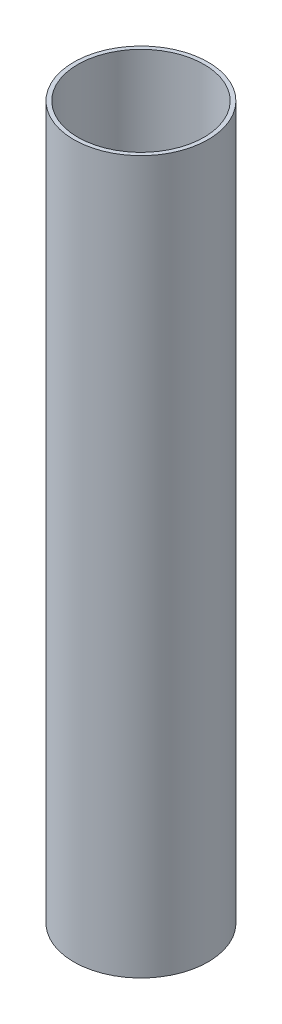
ISO-10303-21;
HEADER;
FILE_DESCRIPTION(('STEP AP214'),'2;1');
FILE_NAME('part.step','',(''),(''),'','','');
FILE_SCHEMA(('AUTOMOTIVE_DESIGN { 1 0 10303 214 1 1 1 1 }'));
ENDSEC;
DATA;
#1=APPLICATION_CONTEXT('core data for automotive mechanical design processes');
#2=APPLICATION_PROTOCOL_DEFINITION('international standard','automotive_design',2000,#1);
#3=PRODUCT_CONTEXT('',#1,'mechanical');
#4=PRODUCT('Part','Part','',(#3));
#5=PRODUCT_RELATED_PRODUCT_CATEGORY('part','',(#4));
#6=PRODUCT_DEFINITION_FORMATION('','',#4);
#7=PRODUCT_DEFINITION_CONTEXT('part definition',#1,'design');
#8=PRODUCT_DEFINITION('design','',#6,#7);
#9=PRODUCT_DEFINITION_SHAPE('','',#8);
#10=(LENGTH_UNIT() NAMED_UNIT(*) SI_UNIT(.MILLI.,.METRE.));
#11=(NAMED_UNIT(*) PLANE_ANGLE_UNIT() SI_UNIT($,.RADIAN.));
#12=(NAMED_UNIT(*) SI_UNIT($,.STERADIAN.) SOLID_ANGLE_UNIT());
#13=UNCERTAINTY_MEASURE_WITH_UNIT(LENGTH_MEASURE(1.E-05),#10,'distance_accuracy_value','');
#14=(GEOMETRIC_REPRESENTATION_CONTEXT(3) GLOBAL_UNCERTAINTY_ASSIGNED_CONTEXT((#13)) GLOBAL_UNIT_ASSIGNED_CONTEXT((#10,
#11,#12)) REPRESENTATION_CONTEXT('',''));
#15=CARTESIAN_POINT('',(0.,0.,0.));
#16=DIRECTION('',(0.,0.,1.));
#17=DIRECTION('',(1.,0.,0.));
#18=AXIS2_PLACEMENT_3D('',#15,#16,#17);
#19=CARTESIAN_POINT('',(0.,220.,0.));
#20=DIRECTION('',(0.,1.,0.));
#21=DIRECTION('',(0.,0.,1.));
#22=AXIS2_PLACEMENT_3D('',#19,#20,#21);
#23=PLANE('',#22);
#24=CARTESIAN_POINT('',(0.,220.,0.));
#25=DIRECTION('',(0.,1.,0.));
#26=DIRECTION('',(0.,0.,1.));
#27=AXIS2_PLACEMENT_3D('',#24,#25,#26);
#28=CIRCLE('',#27,20.75);
#29=CARTESIAN_POINT('',(0.,220.,20.75));
#30=VERTEX_POINT('',#29);
#31=EDGE_CURVE('E10',#30,#30,#28,.T.);
#32=ORIENTED_EDGE('',*,*,#31,.T.);
#33=EDGE_LOOP('',(#32));
#34=FACE_BOUND('',#33,.T.);
#35=CARTESIAN_POINT('',(0.,220.,0.));
#36=DIRECTION('',(0.,1.,0.));
#37=DIRECTION('',(0.,0.,1.));
#38=AXIS2_PLACEMENT_3D('',#35,#36,#37);
#39=CIRCLE('',#38,19.5);
#40=CARTESIAN_POINT('',(0.,220.,19.5));
#41=VERTEX_POINT('',#40);
#42=EDGE_CURVE('E52',#41,#41,#39,.T.);
#43=ORIENTED_EDGE('',*,*,#42,.F.);
#44=EDGE_LOOP('',(#43));
#45=FACE_BOUND('',#44,.T.);
#46=ADVANCED_FACE('F39',(#34,#45),#23,.T.);
#47=CARTESIAN_POINT('',(0.,0.,0.));
#48=DIRECTION('',(0.,1.,0.));
#49=DIRECTION('',(0.,0.,1.));
#50=AXIS2_PLACEMENT_3D('',#47,#48,#49);
#51=PLANE('',#50);
#52=CARTESIAN_POINT('',(0.,0.,0.));
#53=DIRECTION('',(0.,1.,0.));
#54=DIRECTION('',(0.,0.,1.));
#55=AXIS2_PLACEMENT_3D('',#52,#53,#54);
#56=CIRCLE('',#55,20.75);
#57=CARTESIAN_POINT('',(0.,0.,20.75));
#58=VERTEX_POINT('',#57);
#59=EDGE_CURVE('E43',#58,#58,#56,.T.);
#60=ORIENTED_EDGE('',*,*,#59,.F.);
#61=EDGE_LOOP('',(#60));
#62=FACE_BOUND('',#61,.T.);
#63=CARTESIAN_POINT('',(0.,0.,0.));
#64=DIRECTION('',(0.,1.,0.));
#65=DIRECTION('',(0.,0.,1.));
#66=AXIS2_PLACEMENT_3D('',#63,#64,#65);
#67=CIRCLE('',#66,19.5);
#68=CARTESIAN_POINT('',(0.,0.,19.5));
#69=VERTEX_POINT('',#68);
#70=EDGE_CURVE('E54',#69,#69,#67,.T.);
#71=ORIENTED_EDGE('',*,*,#70,.T.);
#72=EDGE_LOOP('',(#71));
#73=FACE_BOUND('',#72,.T.);
#74=ADVANCED_FACE('F66',(#62,#73),#51,.F.);
#75=CARTESIAN_POINT('',(0.,220.,0.));
#76=DIRECTION('',(0.,-1.,0.));
#77=DIRECTION('',(0.,0.,-1.));
#78=AXIS2_PLACEMENT_3D('',#75,#76,#77);
#79=CYLINDRICAL_SURFACE('',#78,20.75);
#80=ORIENTED_EDGE('',*,*,#31,.F.);
#81=EDGE_LOOP('',(#80));
#82=FACE_BOUND('',#81,.T.);
#83=ORIENTED_EDGE('',*,*,#59,.T.);
#84=EDGE_LOOP('',(#83));
#85=FACE_BOUND('',#84,.T.);
#86=ADVANCED_FACE('F41',(#82,#85),#79,.T.);
#87=CARTESIAN_POINT('',(0.,220.,0.));
#88=DIRECTION('',(0.,-1.,0.));
#89=DIRECTION('',(0.,0.,-1.));
#90=AXIS2_PLACEMENT_3D('',#87,#88,#89);
#91=CYLINDRICAL_SURFACE('',#90,19.5);
#92=ORIENTED_EDGE('',*,*,#42,.T.);
#93=EDGE_LOOP('',(#92));
#94=FACE_BOUND('',#93,.T.);
#95=ORIENTED_EDGE('',*,*,#70,.F.);
#96=EDGE_LOOP('',(#95));
#97=FACE_BOUND('',#96,.T.);
#98=ADVANCED_FACE('F62',(#94,#97),#91,.F.);
#99=CLOSED_SHELL('',(#46,#74,#86,#98));
#100=MANIFOLD_SOLID_BREP('B2',#99);
#101=ADVANCED_BREP_SHAPE_REPRESENTATION('',(#18,#100),#14);
#102=SHAPE_DEFINITION_REPRESENTATION(#9,#101);
ENDSEC;
END-ISO-10303-21;
